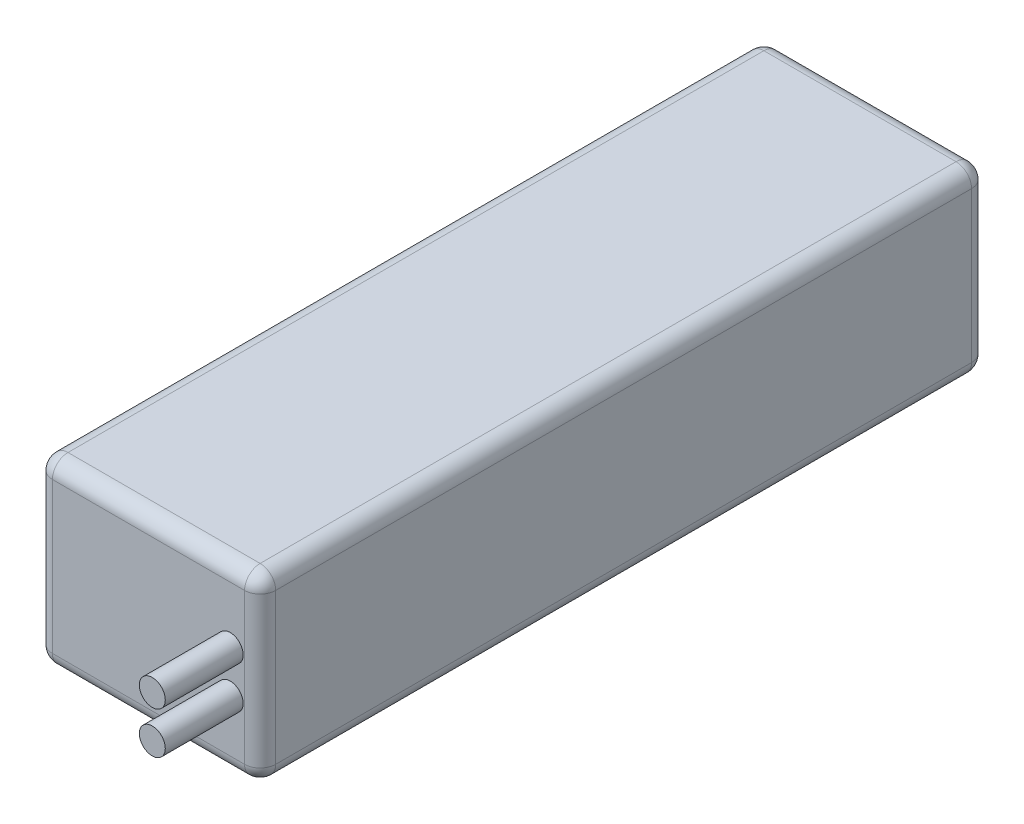
ISO-10303-21;
HEADER;
FILE_DESCRIPTION(('STEP AP214'),'2;1');
FILE_NAME('part.step','',(''),(''),'','','');
FILE_SCHEMA(('AUTOMOTIVE_DESIGN { 1 0 10303 214 1 1 1 1 }'));
ENDSEC;
DATA;
#1=APPLICATION_CONTEXT('core data for automotive mechanical design processes');
#2=APPLICATION_PROTOCOL_DEFINITION('international standard','automotive_design',2000,#1);
#3=PRODUCT_CONTEXT('',#1,'mechanical');
#4=PRODUCT('Part','Part','',(#3));
#5=PRODUCT_RELATED_PRODUCT_CATEGORY('part','',(#4));
#6=PRODUCT_DEFINITION_FORMATION('','',#4);
#7=PRODUCT_DEFINITION_CONTEXT('part definition',#1,'design');
#8=PRODUCT_DEFINITION('design','',#6,#7);
#9=PRODUCT_DEFINITION_SHAPE('','',#8);
#10=(LENGTH_UNIT() NAMED_UNIT(*) SI_UNIT(.MILLI.,.METRE.));
#11=(NAMED_UNIT(*) PLANE_ANGLE_UNIT() SI_UNIT($,.RADIAN.));
#12=(NAMED_UNIT(*) SI_UNIT($,.STERADIAN.) SOLID_ANGLE_UNIT());
#13=UNCERTAINTY_MEASURE_WITH_UNIT(LENGTH_MEASURE(1.E-05),#10,'distance_accuracy_value','');
#14=(GEOMETRIC_REPRESENTATION_CONTEXT(3) GLOBAL_UNCERTAINTY_ASSIGNED_CONTEXT((#13)) GLOBAL_UNIT_ASSIGNED_CONTEXT((#10,
#11,#12)) REPRESENTATION_CONTEXT('',''));
#15=CARTESIAN_POINT('',(0.,0.,0.));
#16=DIRECTION('',(0.,0.,1.));
#17=DIRECTION('',(1.,0.,0.));
#18=AXIS2_PLACEMENT_3D('',#15,#16,#17);
#19=CARTESIAN_POINT('',(0.,0.,140.));
#20=DIRECTION('',(0.,0.,1.));
#21=DIRECTION('',(1.,0.,0.));
#22=AXIS2_PLACEMENT_3D('',#19,#20,#21);
#23=PLANE('',#22);
#24=DIRECTION('',(0.,-1.,0.));
#25=VECTOR('',#24,1.);
#26=CARTESIAN_POINT('',(-18.5,-17.5,140.));
#27=LINE('',#26,#25);
#28=CARTESIAN_POINT('',(-18.5,14.5,140.));
#29=VERTEX_POINT('',#28);
#30=CARTESIAN_POINT('',(-18.5,-14.5,140.));
#31=VERTEX_POINT('',#30);
#32=EDGE_CURVE('E135',#29,#31,#27,.T.);
#33=ORIENTED_EDGE('',*,*,#32,.T.);
#34=DIRECTION('',(1.,0.,0.));
#35=VECTOR('',#34,1.);
#36=CARTESIAN_POINT('',(21.5,-14.5,140.));
#37=LINE('',#36,#35);
#38=CARTESIAN_POINT('',(18.5,-14.5,140.));
#39=VERTEX_POINT('',#38);
#40=EDGE_CURVE('E131',#31,#39,#37,.T.);
#41=ORIENTED_EDGE('',*,*,#40,.T.);
#42=DIRECTION('',(0.,1.,0.));
#43=VECTOR('',#42,1.);
#44=CARTESIAN_POINT('',(18.5,17.5,140.));
#45=LINE('',#44,#43);
#46=CARTESIAN_POINT('',(18.5,14.5,140.));
#47=VERTEX_POINT('',#46);
#48=EDGE_CURVE('E125',#39,#47,#45,.T.);
#49=ORIENTED_EDGE('',*,*,#48,.T.);
#50=DIRECTION('',(-1.,0.,0.));
#51=VECTOR('',#50,1.);
#52=CARTESIAN_POINT('',(-21.5,14.5,140.));
#53=LINE('',#52,#51);
#54=EDGE_CURVE('E128',#47,#29,#53,.T.);
#55=ORIENTED_EDGE('',*,*,#54,.T.);
#56=EDGE_LOOP('',(#33,#41,#49,#55));
#57=FACE_BOUND('',#56,.T.);
#58=CARTESIAN_POINT('',(15.7347430074703,3.59863996227682,140.));
#59=DIRECTION('',(0.,0.,1.));
#60=DIRECTION('',(1.,0.,0.));
#61=AXIS2_PLACEMENT_3D('',#58,#59,#60);
#62=CIRCLE('',#61,2.5);
#63=CARTESIAN_POINT('',(18.2347430074703,3.59863996227682,140.));
#64=VERTEX_POINT('',#63);
#65=EDGE_CURVE('E215',#64,#64,#62,.T.);
#66=ORIENTED_EDGE('',*,*,#65,.F.);
#67=EDGE_LOOP('',(#66));
#68=FACE_BOUND('',#67,.T.);
#69=CARTESIAN_POINT('',(15.7347430074703,-4.49209540118582,140.));
#70=DIRECTION('',(0.,0.,1.));
#71=DIRECTION('',(1.,0.,0.));
#72=AXIS2_PLACEMENT_3D('',#69,#70,#71);
#73=CIRCLE('',#72,2.5);
#74=CARTESIAN_POINT('',(18.2347430074703,-4.49209540118582,140.));
#75=VERTEX_POINT('',#74);
#76=EDGE_CURVE('E203',#75,#75,#73,.T.);
#77=ORIENTED_EDGE('',*,*,#76,.F.);
#78=EDGE_LOOP('',(#77));
#79=FACE_BOUND('',#78,.T.);
#80=ADVANCED_FACE('F37',(#57,#68,#79),#23,.T.);
#81=CARTESIAN_POINT('',(21.5,17.5,140.));
#82=DIRECTION('',(-1.,0.,0.));
#83=DIRECTION('',(0.,-1.,0.));
#84=AXIS2_PLACEMENT_3D('',#81,#82,#83);
#85=PLANE('',#84);
#86=DIRECTION('',(0.,1.,0.));
#87=VECTOR('',#86,1.);
#88=CARTESIAN_POINT('',(21.5,-17.5,137.));
#89=LINE('',#88,#87);
#90=CARTESIAN_POINT('',(21.5,14.5,137.));
#91=VERTEX_POINT('',#90);
#92=CARTESIAN_POINT('',(21.5,-14.5,137.));
#93=VERTEX_POINT('',#92);
#94=EDGE_CURVE('E157',#91,#93,#89,.F.);
#95=ORIENTED_EDGE('',*,*,#94,.T.);
#96=DIRECTION('',(0.,0.,-1.));
#97=VECTOR('',#96,1.);
#98=CARTESIAN_POINT('',(21.5,-14.5,140.));
#99=LINE('',#98,#97);
#100=CARTESIAN_POINT('',(21.5,-14.5,3.));
#101=VERTEX_POINT('',#100);
#102=EDGE_CURVE('E256',#93,#101,#99,.T.);
#103=ORIENTED_EDGE('',*,*,#102,.T.);
#104=DIRECTION('',(0.,1.,0.));
#105=VECTOR('',#104,1.);
#106=CARTESIAN_POINT('',(21.5,17.5,3.));
#107=LINE('',#106,#105);
#108=CARTESIAN_POINT('',(21.5,14.5,3.));
#109=VERTEX_POINT('',#108);
#110=EDGE_CURVE('E253',#101,#109,#107,.T.);
#111=ORIENTED_EDGE('',*,*,#110,.T.);
#112=DIRECTION('',(0.,0.,-1.));
#113=VECTOR('',#112,1.);
#114=CARTESIAN_POINT('',(21.5,14.5,140.));
#115=LINE('',#114,#113);
#116=EDGE_CURVE('E251',#109,#91,#115,.F.);
#117=ORIENTED_EDGE('',*,*,#116,.T.);
#118=EDGE_LOOP('',(#95,#103,#111,#117));
#119=FACE_BOUND('',#118,.T.);
#120=ADVANCED_FACE('F302',(#119),#85,.F.);
#121=CARTESIAN_POINT('',(-21.5,17.5,140.));
#122=DIRECTION('',(0.,-1.,0.));
#123=DIRECTION('',(0.,0.,-1.));
#124=AXIS2_PLACEMENT_3D('',#121,#122,#123);
#125=PLANE('',#124);
#126=DIRECTION('',(-1.,0.,0.));
#127=VECTOR('',#126,1.);
#128=CARTESIAN_POINT('',(21.5,17.5,137.));
#129=LINE('',#128,#127);
#130=CARTESIAN_POINT('',(-18.5,17.5,137.));
#131=VERTEX_POINT('',#130);
#132=CARTESIAN_POINT('',(18.5,17.5,137.));
#133=VERTEX_POINT('',#132);
#134=EDGE_CURVE('E46',#131,#133,#129,.F.);
#135=ORIENTED_EDGE('',*,*,#134,.T.);
#136=DIRECTION('',(0.,0.,-1.));
#137=VECTOR('',#136,1.);
#138=CARTESIAN_POINT('',(18.5,17.5,140.));
#139=LINE('',#138,#137);
#140=CARTESIAN_POINT('',(18.5,17.5,3.));
#141=VERTEX_POINT('',#140);
#142=EDGE_CURVE('E11',#133,#141,#139,.T.);
#143=ORIENTED_EDGE('',*,*,#142,.T.);
#144=DIRECTION('',(-1.,0.,0.));
#145=VECTOR('',#144,1.);
#146=CARTESIAN_POINT('',(-21.5,17.5,3.));
#147=LINE('',#146,#145);
#148=CARTESIAN_POINT('',(-18.5,17.5,3.));
#149=VERTEX_POINT('',#148);
#150=EDGE_CURVE('E259',#141,#149,#147,.T.);
#151=ORIENTED_EDGE('',*,*,#150,.T.);
#152=DIRECTION('',(0.,0.,-1.));
#153=VECTOR('',#152,1.);
#154=CARTESIAN_POINT('',(-18.5,17.5,140.));
#155=LINE('',#154,#153);
#156=EDGE_CURVE('E57',#149,#131,#155,.F.);
#157=ORIENTED_EDGE('',*,*,#156,.T.);
#158=EDGE_LOOP('',(#135,#143,#151,#157));
#159=FACE_BOUND('',#158,.T.);
#160=ADVANCED_FACE('F307',(#159),#125,.F.);
#161=CARTESIAN_POINT('',(-21.5,17.5,140.));
#162=DIRECTION('',(1.,0.,0.));
#163=DIRECTION('',(0.,1.,0.));
#164=AXIS2_PLACEMENT_3D('',#161,#162,#163);
#165=PLANE('',#164);
#166=DIRECTION('',(0.,0.,-1.));
#167=VECTOR('',#166,1.);
#168=CARTESIAN_POINT('',(-21.5,-14.5,140.));
#169=LINE('',#168,#167);
#170=CARTESIAN_POINT('',(-21.5,-14.5,3.));
#171=VERTEX_POINT('',#170);
#172=CARTESIAN_POINT('',(-21.5,-14.5,137.));
#173=VERTEX_POINT('',#172);
#174=EDGE_CURVE('E237',#171,#173,#169,.F.);
#175=ORIENTED_EDGE('',*,*,#174,.T.);
#176=DIRECTION('',(0.,-1.,0.));
#177=VECTOR('',#176,1.);
#178=CARTESIAN_POINT('',(-21.5,17.5,137.));
#179=LINE('',#178,#177);
#180=CARTESIAN_POINT('',(-21.5,14.5,137.));
#181=VERTEX_POINT('',#180);
#182=EDGE_CURVE('E239',#173,#181,#179,.F.);
#183=ORIENTED_EDGE('',*,*,#182,.T.);
#184=DIRECTION('',(0.,0.,-1.));
#185=VECTOR('',#184,1.);
#186=CARTESIAN_POINT('',(-21.5,14.5,140.));
#187=LINE('',#186,#185);
#188=CARTESIAN_POINT('',(-21.5,14.5,3.));
#189=VERTEX_POINT('',#188);
#190=EDGE_CURVE('E233',#181,#189,#187,.T.);
#191=ORIENTED_EDGE('',*,*,#190,.T.);
#192=DIRECTION('',(0.,-1.,0.));
#193=VECTOR('',#192,1.);
#194=CARTESIAN_POINT('',(-21.5,17.5,3.));
#195=LINE('',#194,#193);
#196=EDGE_CURVE('E235',#189,#171,#195,.T.);
#197=ORIENTED_EDGE('',*,*,#196,.T.);
#198=EDGE_LOOP('',(#175,#183,#191,#197));
#199=FACE_BOUND('',#198,.T.);
#200=ADVANCED_FACE('F322',(#199),#165,.F.);
#201=CARTESIAN_POINT('',(-21.5,-17.5,140.));
#202=DIRECTION('',(0.,1.,0.));
#203=DIRECTION('',(0.,0.,1.));
#204=AXIS2_PLACEMENT_3D('',#201,#202,#203);
#205=PLANE('',#204);
#206=DIRECTION('',(0.,0.,-1.));
#207=VECTOR('',#206,1.);
#208=CARTESIAN_POINT('',(18.5,-17.5,140.));
#209=LINE('',#208,#207);
#210=CARTESIAN_POINT('',(18.5,-17.5,3.));
#211=VERTEX_POINT('',#210);
#212=CARTESIAN_POINT('',(18.5,-17.5,137.));
#213=VERTEX_POINT('',#212);
#214=EDGE_CURVE('E224',#211,#213,#209,.F.);
#215=ORIENTED_EDGE('',*,*,#214,.T.);
#216=DIRECTION('',(1.,0.,0.));
#217=VECTOR('',#216,1.);
#218=CARTESIAN_POINT('',(-21.5,-17.5,137.));
#219=LINE('',#218,#217);
#220=CARTESIAN_POINT('',(-18.5,-17.5,137.));
#221=VERTEX_POINT('',#220);
#222=EDGE_CURVE('E230',#213,#221,#219,.F.);
#223=ORIENTED_EDGE('',*,*,#222,.T.);
#224=DIRECTION('',(0.,0.,-1.));
#225=VECTOR('',#224,1.);
#226=CARTESIAN_POINT('',(-18.5,-17.5,140.));
#227=LINE('',#226,#225);
#228=CARTESIAN_POINT('',(-18.5,-17.5,3.));
#229=VERTEX_POINT('',#228);
#230=EDGE_CURVE('E228',#221,#229,#227,.T.);
#231=ORIENTED_EDGE('',*,*,#230,.T.);
#232=DIRECTION('',(1.,0.,0.));
#233=VECTOR('',#232,1.);
#234=CARTESIAN_POINT('',(-21.5,-17.5,3.));
#235=LINE('',#234,#233);
#236=EDGE_CURVE('E226',#229,#211,#235,.T.);
#237=ORIENTED_EDGE('',*,*,#236,.T.);
#238=EDGE_LOOP('',(#215,#223,#231,#237));
#239=FACE_BOUND('',#238,.T.);
#240=ADVANCED_FACE('F289',(#239),#205,.F.);
#241=CARTESIAN_POINT('',(0.,0.,0.));
#242=DIRECTION('',(0.,0.,1.));
#243=DIRECTION('',(1.,0.,0.));
#244=AXIS2_PLACEMENT_3D('',#241,#242,#243);
#245=PLANE('',#244);
#246=DIRECTION('',(1.,0.,0.));
#247=VECTOR('',#246,1.);
#248=CARTESIAN_POINT('',(0.,-14.5,0.));
#249=LINE('',#248,#247);
#250=CARTESIAN_POINT('',(18.5,-14.5,0.));
#251=VERTEX_POINT('',#250);
#252=CARTESIAN_POINT('',(-18.5,-14.5,0.));
#253=VERTEX_POINT('',#252);
#254=EDGE_CURVE('E246',#251,#253,#249,.F.);
#255=ORIENTED_EDGE('',*,*,#254,.T.);
#256=DIRECTION('',(0.,-1.,0.));
#257=VECTOR('',#256,1.);
#258=CARTESIAN_POINT('',(-18.5,0.,0.));
#259=LINE('',#258,#257);
#260=CARTESIAN_POINT('',(-18.5,14.5,0.));
#261=VERTEX_POINT('',#260);
#262=EDGE_CURVE('E248',#253,#261,#259,.F.);
#263=ORIENTED_EDGE('',*,*,#262,.T.);
#264=DIRECTION('',(-1.,0.,0.));
#265=VECTOR('',#264,1.);
#266=CARTESIAN_POINT('',(0.,14.5,0.));
#267=LINE('',#266,#265);
#268=CARTESIAN_POINT('',(18.5,14.5,0.));
#269=VERTEX_POINT('',#268);
#270=EDGE_CURVE('E242',#261,#269,#267,.F.);
#271=ORIENTED_EDGE('',*,*,#270,.T.);
#272=DIRECTION('',(0.,1.,0.));
#273=VECTOR('',#272,1.);
#274=CARTESIAN_POINT('',(18.5,0.,0.));
#275=LINE('',#274,#273);
#276=EDGE_CURVE('E244',#269,#251,#275,.F.);
#277=ORIENTED_EDGE('',*,*,#276,.T.);
#278=EDGE_LOOP('',(#255,#263,#271,#277));
#279=FACE_BOUND('',#278,.T.);
#280=ADVANCED_FACE('F358',(#279),#245,.F.);
#281=CARTESIAN_POINT('',(15.7347430074703,3.59863996227682,155.));
#282=DIRECTION('',(0.,0.,-1.));
#283=DIRECTION('',(-1.,0.,0.));
#284=AXIS2_PLACEMENT_3D('',#281,#282,#283);
#285=CYLINDRICAL_SURFACE('',#284,2.5);
#286=CARTESIAN_POINT('',(15.7347430074703,3.59863996227682,155.));
#287=DIRECTION('',(0.,0.,1.));
#288=DIRECTION('',(1.,0.,0.));
#289=AXIS2_PLACEMENT_3D('',#286,#287,#288);
#290=CIRCLE('',#289,2.5);
#291=CARTESIAN_POINT('',(18.2347430074703,3.59863996227682,155.));
#292=VERTEX_POINT('',#291);
#293=EDGE_CURVE('E146',#292,#292,#290,.T.);
#294=ORIENTED_EDGE('',*,*,#293,.F.);
#295=EDGE_LOOP('',(#294));
#296=FACE_BOUND('',#295,.T.);
#297=ORIENTED_EDGE('',*,*,#65,.T.);
#298=EDGE_LOOP('',(#297));
#299=FACE_BOUND('',#298,.T.);
#300=ADVANCED_FACE('F356',(#296,#299),#285,.T.);
#301=CARTESIAN_POINT('',(15.7347430074703,3.59863996227682,155.));
#302=DIRECTION('',(0.,0.,1.));
#303=DIRECTION('',(1.,0.,0.));
#304=AXIS2_PLACEMENT_3D('',#301,#302,#303);
#305=PLANE('',#304);
#306=ORIENTED_EDGE('',*,*,#293,.T.);
#307=EDGE_LOOP('',(#306));
#308=FACE_BOUND('',#307,.T.);
#309=ADVANCED_FACE('F534',(#308),#305,.T.);
#310=CARTESIAN_POINT('',(15.7347430074703,-4.49209540118582,155.));
#311=DIRECTION('',(0.,0.,-1.));
#312=DIRECTION('',(-1.,0.,0.));
#313=AXIS2_PLACEMENT_3D('',#310,#311,#312);
#314=CYLINDRICAL_SURFACE('',#313,2.5);
#315=CARTESIAN_POINT('',(15.7347430074703,-4.49209540118582,155.));
#316=DIRECTION('',(0.,0.,1.));
#317=DIRECTION('',(1.,0.,0.));
#318=AXIS2_PLACEMENT_3D('',#315,#316,#317);
#319=CIRCLE('',#318,2.5);
#320=CARTESIAN_POINT('',(18.2347430074703,-4.49209540118582,155.));
#321=VERTEX_POINT('',#320);
#322=EDGE_CURVE('E210',#321,#321,#319,.T.);
#323=ORIENTED_EDGE('',*,*,#322,.F.);
#324=EDGE_LOOP('',(#323));
#325=FACE_BOUND('',#324,.T.);
#326=ORIENTED_EDGE('',*,*,#76,.T.);
#327=EDGE_LOOP('',(#326));
#328=FACE_BOUND('',#327,.T.);
#329=ADVANCED_FACE('F524',(#325,#328),#314,.T.);
#330=CARTESIAN_POINT('',(15.7347430074703,-4.49209540118582,155.));
#331=DIRECTION('',(0.,0.,1.));
#332=DIRECTION('',(1.,0.,0.));
#333=AXIS2_PLACEMENT_3D('',#330,#331,#332);
#334=PLANE('',#333);
#335=ORIENTED_EDGE('',*,*,#322,.T.);
#336=EDGE_LOOP('',(#335));
#337=FACE_BOUND('',#336,.T.);
#338=ADVANCED_FACE('F516',(#337),#334,.T.);
#339=CARTESIAN_POINT('',(-21.5,14.5,3.));
#340=DIRECTION('',(-1.,0.,0.));
#341=DIRECTION('',(0.,0.,1.));
#342=AXIS2_PLACEMENT_3D('',#339,#340,#341);
#343=CYLINDRICAL_SURFACE('',#342,3.);
#344=CARTESIAN_POINT('',(-18.5,14.5,3.));
#345=DIRECTION('',(-1.,0.,0.));
#346=DIRECTION('',(0.,0.,1.));
#347=AXIS2_PLACEMENT_3D('',#344,#345,#346);
#348=CIRCLE('',#347,3.);
#349=EDGE_CURVE('E41',#149,#261,#348,.T.);
#350=ORIENTED_EDGE('',*,*,#349,.F.);
#351=ORIENTED_EDGE('',*,*,#150,.F.);
#352=CARTESIAN_POINT('',(18.5,14.5,3.));
#353=DIRECTION('',(1.,0.,0.));
#354=DIRECTION('',(0.,0.,-1.));
#355=AXIS2_PLACEMENT_3D('',#352,#353,#354);
#356=CIRCLE('',#355,3.);
#357=EDGE_CURVE('E195',#269,#141,#356,.T.);
#358=ORIENTED_EDGE('',*,*,#357,.F.);
#359=ORIENTED_EDGE('',*,*,#270,.F.);
#360=EDGE_LOOP('',(#350,#351,#358,#359));
#361=FACE_BOUND('',#360,.T.);
#362=ADVANCED_FACE('F39',(#361),#343,.T.);
#363=CARTESIAN_POINT('',(-18.5,14.5,3.));
#364=DIRECTION('',(0.,0.,1.));
#365=DIRECTION('',(1.,0.,0.));
#366=AXIS2_PLACEMENT_3D('',#363,#364,#365);
#367=SPHERICAL_SURFACE('',#366,3.);
#368=CARTESIAN_POINT('',(-18.5,14.5,3.));
#369=DIRECTION('',(0.,0.,-1.));
#370=DIRECTION('',(-1.,0.,0.));
#371=AXIS2_PLACEMENT_3D('',#368,#369,#370);
#372=CIRCLE('',#371,3.);
#373=EDGE_CURVE('E191',#149,#189,#372,.F.);
#374=ORIENTED_EDGE('',*,*,#373,.F.);
#375=ORIENTED_EDGE('',*,*,#349,.T.);
#376=CARTESIAN_POINT('',(-18.5,14.5,3.));
#377=DIRECTION('',(0.,1.,0.));
#378=DIRECTION('',(0.,0.,1.));
#379=AXIS2_PLACEMENT_3D('',#376,#377,#378);
#380=CIRCLE('',#379,3.);
#381=EDGE_CURVE('E194',#189,#261,#380,.F.);
#382=ORIENTED_EDGE('',*,*,#381,.F.);
#383=EDGE_LOOP('',(#374,#375,#382));
#384=FACE_BOUND('',#383,.T.);
#385=ADVANCED_FACE('F309',(#384),#367,.T.);
#386=CARTESIAN_POINT('',(18.5,14.5,3.));
#387=DIRECTION('',(0.,0.,1.));
#388=DIRECTION('',(1.,0.,0.));
#389=AXIS2_PLACEMENT_3D('',#386,#387,#388);
#390=SPHERICAL_SURFACE('',#389,3.);
#391=CARTESIAN_POINT('',(18.5,14.5,3.));
#392=DIRECTION('',(0.,1.,0.));
#393=DIRECTION('',(0.,0.,1.));
#394=AXIS2_PLACEMENT_3D('',#391,#392,#393);
#395=CIRCLE('',#394,3.);
#396=EDGE_CURVE('E186',#269,#109,#395,.F.);
#397=ORIENTED_EDGE('',*,*,#396,.F.);
#398=ORIENTED_EDGE('',*,*,#357,.T.);
#399=CARTESIAN_POINT('',(18.5,14.5,3.));
#400=DIRECTION('',(0.,0.,-1.));
#401=DIRECTION('',(-1.,0.,0.));
#402=AXIS2_PLACEMENT_3D('',#399,#400,#401);
#403=CIRCLE('',#402,3.);
#404=EDGE_CURVE('E189',#109,#141,#403,.F.);
#405=ORIENTED_EDGE('',*,*,#404,.F.);
#406=EDGE_LOOP('',(#397,#398,#405));
#407=FACE_BOUND('',#406,.T.);
#408=ADVANCED_FACE('F340',(#407),#390,.T.);
#409=CARTESIAN_POINT('',(-18.5,17.5,3.));
#410=DIRECTION('',(0.,-1.,0.));
#411=DIRECTION('',(1.,0.,0.));
#412=AXIS2_PLACEMENT_3D('',#409,#410,#411);
#413=CYLINDRICAL_SURFACE('',#412,3.);
#414=ORIENTED_EDGE('',*,*,#381,.T.);
#415=ORIENTED_EDGE('',*,*,#262,.F.);
#416=CARTESIAN_POINT('',(-18.5,-14.5,3.));
#417=DIRECTION('',(0.,-1.,0.));
#418=DIRECTION('',(0.,0.,-1.));
#419=AXIS2_PLACEMENT_3D('',#416,#417,#418);
#420=CIRCLE('',#419,3.);
#421=EDGE_CURVE('E180',#171,#253,#420,.T.);
#422=ORIENTED_EDGE('',*,*,#421,.F.);
#423=ORIENTED_EDGE('',*,*,#196,.F.);
#424=EDGE_LOOP('',(#414,#415,#422,#423));
#425=FACE_BOUND('',#424,.T.);
#426=ADVANCED_FACE('F326',(#425),#413,.T.);
#427=CARTESIAN_POINT('',(-18.5,14.5,140.));
#428=DIRECTION('',(0.,0.,-1.));
#429=DIRECTION('',(-1.,0.,0.));
#430=AXIS2_PLACEMENT_3D('',#427,#428,#429);
#431=CYLINDRICAL_SURFACE('',#430,3.);
#432=ORIENTED_EDGE('',*,*,#373,.T.);
#433=ORIENTED_EDGE('',*,*,#190,.F.);
#434=CARTESIAN_POINT('',(-18.5,14.5,137.));
#435=DIRECTION('',(0.,0.,1.));
#436=DIRECTION('',(1.,0.,0.));
#437=AXIS2_PLACEMENT_3D('',#434,#435,#436);
#438=CIRCLE('',#437,3.);
#439=EDGE_CURVE('E177',#131,#181,#438,.T.);
#440=ORIENTED_EDGE('',*,*,#439,.F.);
#441=ORIENTED_EDGE('',*,*,#156,.F.);
#442=EDGE_LOOP('',(#432,#433,#440,#441));
#443=FACE_BOUND('',#442,.T.);
#444=ADVANCED_FACE('F314',(#443),#431,.T.);
#445=CARTESIAN_POINT('',(0.,14.5,137.));
#446=DIRECTION('',(1.,0.,0.));
#447=DIRECTION('',(0.,0.,-1.));
#448=AXIS2_PLACEMENT_3D('',#445,#446,#447);
#449=CYLINDRICAL_SURFACE('',#448,3.);
#450=CARTESIAN_POINT('',(18.5,14.5,137.));
#451=DIRECTION('',(1.,0.,0.));
#452=DIRECTION('',(0.,0.,-1.));
#453=AXIS2_PLACEMENT_3D('',#450,#451,#452);
#454=CIRCLE('',#453,3.);
#455=EDGE_CURVE('E141',#133,#47,#454,.T.);
#456=ORIENTED_EDGE('',*,*,#455,.F.);
#457=ORIENTED_EDGE('',*,*,#134,.F.);
#458=CARTESIAN_POINT('',(-18.5,14.5,137.));
#459=DIRECTION('',(-1.,0.,0.));
#460=DIRECTION('',(0.,0.,1.));
#461=AXIS2_PLACEMENT_3D('',#458,#459,#460);
#462=CIRCLE('',#461,3.);
#463=EDGE_CURVE('E144',#29,#131,#462,.T.);
#464=ORIENTED_EDGE('',*,*,#463,.F.);
#465=ORIENTED_EDGE('',*,*,#54,.F.);
#466=EDGE_LOOP('',(#456,#457,#464,#465));
#467=FACE_BOUND('',#466,.T.);
#468=ADVANCED_FACE('F140',(#467),#449,.T.);
#469=CARTESIAN_POINT('',(18.5,14.5,140.));
#470=DIRECTION('',(0.,0.,-1.));
#471=DIRECTION('',(-1.,0.,0.));
#472=AXIS2_PLACEMENT_3D('',#469,#470,#471);
#473=CYLINDRICAL_SURFACE('',#472,3.);
#474=ORIENTED_EDGE('',*,*,#404,.T.);
#475=ORIENTED_EDGE('',*,*,#142,.F.);
#476=CARTESIAN_POINT('',(18.5,14.5,137.));
#477=DIRECTION('',(0.,0.,1.));
#478=DIRECTION('',(1.,0.,0.));
#479=AXIS2_PLACEMENT_3D('',#476,#477,#478);
#480=CIRCLE('',#479,3.);
#481=EDGE_CURVE('E154',#91,#133,#480,.T.);
#482=ORIENTED_EDGE('',*,*,#481,.F.);
#483=ORIENTED_EDGE('',*,*,#116,.F.);
#484=EDGE_LOOP('',(#474,#475,#482,#483));
#485=FACE_BOUND('',#484,.T.);
#486=ADVANCED_FACE('F306',(#485),#473,.T.);
#487=CARTESIAN_POINT('',(18.5,17.5,3.));
#488=DIRECTION('',(0.,1.,0.));
#489=DIRECTION('',(-1.,0.,0.));
#490=AXIS2_PLACEMENT_3D('',#487,#488,#489);
#491=CYLINDRICAL_SURFACE('',#490,3.);
#492=ORIENTED_EDGE('',*,*,#396,.T.);
#493=ORIENTED_EDGE('',*,*,#110,.F.);
#494=CARTESIAN_POINT('',(18.5,-14.5,3.));
#495=DIRECTION('',(0.,-1.,0.));
#496=DIRECTION('',(1.,0.,0.));
#497=AXIS2_PLACEMENT_3D('',#494,#495,#496);
#498=CIRCLE('',#497,3.);
#499=EDGE_CURVE('E172',#251,#101,#498,.T.);
#500=ORIENTED_EDGE('',*,*,#499,.F.);
#501=ORIENTED_EDGE('',*,*,#276,.F.);
#502=EDGE_LOOP('',(#492,#493,#500,#501));
#503=FACE_BOUND('',#502,.T.);
#504=ADVANCED_FACE('F339',(#503),#491,.T.);
#505=CARTESIAN_POINT('',(-21.5,-14.5,3.));
#506=DIRECTION('',(1.,0.,0.));
#507=DIRECTION('',(0.,0.,-1.));
#508=AXIS2_PLACEMENT_3D('',#505,#506,#507);
#509=CYLINDRICAL_SURFACE('',#508,3.);
#510=CARTESIAN_POINT('',(-18.5,-14.5,3.));
#511=DIRECTION('',(-1.,0.,0.));
#512=DIRECTION('',(0.,0.,1.));
#513=AXIS2_PLACEMENT_3D('',#510,#511,#512);
#514=CIRCLE('',#513,3.);
#515=EDGE_CURVE('E183',#253,#229,#514,.T.);
#516=ORIENTED_EDGE('',*,*,#515,.F.);
#517=ORIENTED_EDGE('',*,*,#254,.F.);
#518=CARTESIAN_POINT('',(18.5,-14.5,3.));
#519=DIRECTION('',(1.,0.,0.));
#520=DIRECTION('',(0.,0.,-1.));
#521=AXIS2_PLACEMENT_3D('',#518,#519,#520);
#522=CIRCLE('',#521,3.);
#523=EDGE_CURVE('E169',#211,#251,#522,.T.);
#524=ORIENTED_EDGE('',*,*,#523,.F.);
#525=ORIENTED_EDGE('',*,*,#236,.F.);
#526=EDGE_LOOP('',(#516,#517,#524,#525));
#527=FACE_BOUND('',#526,.T.);
#528=ADVANCED_FACE('F332',(#527),#509,.T.);
#529=CARTESIAN_POINT('',(-18.5,-14.5,3.));
#530=DIRECTION('',(0.,0.,1.));
#531=DIRECTION('',(1.,0.,0.));
#532=AXIS2_PLACEMENT_3D('',#529,#530,#531);
#533=SPHERICAL_SURFACE('',#532,3.);
#534=ORIENTED_EDGE('',*,*,#421,.T.);
#535=ORIENTED_EDGE('',*,*,#515,.T.);
#536=CARTESIAN_POINT('',(-18.5,-14.5,3.));
#537=DIRECTION('',(0.,0.,-1.));
#538=DIRECTION('',(-1.,0.,0.));
#539=AXIS2_PLACEMENT_3D('',#536,#537,#538);
#540=CIRCLE('',#539,3.);
#541=EDGE_CURVE('E161',#171,#229,#540,.F.);
#542=ORIENTED_EDGE('',*,*,#541,.F.);
#543=EDGE_LOOP('',(#534,#535,#542));
#544=FACE_BOUND('',#543,.T.);
#545=ADVANCED_FACE('F329',(#544),#533,.T.);
#546=CARTESIAN_POINT('',(-18.5,14.5,137.));
#547=DIRECTION('',(0.,0.,1.));
#548=DIRECTION('',(1.,0.,0.));
#549=AXIS2_PLACEMENT_3D('',#546,#547,#548);
#550=SPHERICAL_SURFACE('',#549,3.);
#551=ORIENTED_EDGE('',*,*,#463,.T.);
#552=ORIENTED_EDGE('',*,*,#439,.T.);
#553=CARTESIAN_POINT('',(-18.5,14.5,137.));
#554=DIRECTION('',(0.,1.,0.));
#555=DIRECTION('',(0.,0.,1.));
#556=AXIS2_PLACEMENT_3D('',#553,#554,#555);
#557=CIRCLE('',#556,3.);
#558=EDGE_CURVE('E158',#29,#181,#557,.F.);
#559=ORIENTED_EDGE('',*,*,#558,.F.);
#560=EDGE_LOOP('',(#551,#552,#559));
#561=FACE_BOUND('',#560,.T.);
#562=ADVANCED_FACE('F316',(#561),#550,.T.);
#563=CARTESIAN_POINT('',(18.5,14.5,137.));
#564=DIRECTION('',(0.,0.,1.));
#565=DIRECTION('',(1.,0.,0.));
#566=AXIS2_PLACEMENT_3D('',#563,#564,#565);
#567=SPHERICAL_SURFACE('',#566,3.);
#568=ORIENTED_EDGE('',*,*,#481,.T.);
#569=ORIENTED_EDGE('',*,*,#455,.T.);
#570=CARTESIAN_POINT('',(18.5,14.5,137.));
#571=DIRECTION('',(0.,1.,0.));
#572=DIRECTION('',(0.,0.,1.));
#573=AXIS2_PLACEMENT_3D('',#570,#571,#572);
#574=CIRCLE('',#573,3.);
#575=EDGE_CURVE('E151',#91,#47,#574,.F.);
#576=ORIENTED_EDGE('',*,*,#575,.F.);
#577=EDGE_LOOP('',(#568,#569,#576));
#578=FACE_BOUND('',#577,.T.);
#579=ADVANCED_FACE('F150',(#578),#567,.T.);
#580=CARTESIAN_POINT('',(18.5,-14.5,3.));
#581=DIRECTION('',(0.,0.,1.));
#582=DIRECTION('',(1.,0.,0.));
#583=AXIS2_PLACEMENT_3D('',#580,#581,#582);
#584=SPHERICAL_SURFACE('',#583,3.);
#585=ORIENTED_EDGE('',*,*,#523,.T.);
#586=ORIENTED_EDGE('',*,*,#499,.T.);
#587=CARTESIAN_POINT('',(18.5,-14.5,3.));
#588=DIRECTION('',(0.,0.,-1.));
#589=DIRECTION('',(-1.,0.,0.));
#590=AXIS2_PLACEMENT_3D('',#587,#588,#589);
#591=CIRCLE('',#590,3.);
#592=EDGE_CURVE('E159',#211,#101,#591,.F.);
#593=ORIENTED_EDGE('',*,*,#592,.F.);
#594=EDGE_LOOP('',(#585,#586,#593));
#595=FACE_BOUND('',#594,.T.);
#596=ADVANCED_FACE('F336',(#595),#584,.T.);
#597=CARTESIAN_POINT('',(-18.5,-14.5,140.));
#598=DIRECTION('',(0.,0.,-1.));
#599=DIRECTION('',(-1.,0.,0.));
#600=AXIS2_PLACEMENT_3D('',#597,#598,#599);
#601=CYLINDRICAL_SURFACE('',#600,3.);
#602=ORIENTED_EDGE('',*,*,#541,.T.);
#603=ORIENTED_EDGE('',*,*,#230,.F.);
#604=CARTESIAN_POINT('',(-18.5,-14.5,137.));
#605=DIRECTION('',(0.,0.,1.));
#606=DIRECTION('',(1.,0.,0.));
#607=AXIS2_PLACEMENT_3D('',#604,#605,#606);
#608=CIRCLE('',#607,3.);
#609=EDGE_CURVE('E163',#173,#221,#608,.T.);
#610=ORIENTED_EDGE('',*,*,#609,.F.);
#611=ORIENTED_EDGE('',*,*,#174,.F.);
#612=EDGE_LOOP('',(#602,#603,#610,#611));
#613=FACE_BOUND('',#612,.T.);
#614=ADVANCED_FACE('F284',(#613),#601,.T.);
#615=CARTESIAN_POINT('',(-18.5,0.,137.));
#616=DIRECTION('',(0.,1.,0.));
#617=DIRECTION('',(-1.,0.,0.));
#618=AXIS2_PLACEMENT_3D('',#615,#616,#617);
#619=CYLINDRICAL_SURFACE('',#618,3.);
#620=ORIENTED_EDGE('',*,*,#558,.T.);
#621=ORIENTED_EDGE('',*,*,#182,.F.);
#622=CARTESIAN_POINT('',(-18.5,-14.5,137.));
#623=DIRECTION('',(0.,-1.,0.));
#624=DIRECTION('',(0.,0.,-1.));
#625=AXIS2_PLACEMENT_3D('',#622,#623,#624);
#626=CIRCLE('',#625,3.);
#627=EDGE_CURVE('E273',#31,#173,#626,.T.);
#628=ORIENTED_EDGE('',*,*,#627,.F.);
#629=ORIENTED_EDGE('',*,*,#32,.F.);
#630=EDGE_LOOP('',(#620,#621,#628,#629));
#631=FACE_BOUND('',#630,.T.);
#632=ADVANCED_FACE('F320',(#631),#619,.T.);
#633=CARTESIAN_POINT('',(18.5,0.,137.));
#634=DIRECTION('',(0.,-1.,0.));
#635=DIRECTION('',(1.,0.,0.));
#636=AXIS2_PLACEMENT_3D('',#633,#634,#635);
#637=CYLINDRICAL_SURFACE('',#636,3.);
#638=ORIENTED_EDGE('',*,*,#575,.T.);
#639=ORIENTED_EDGE('',*,*,#48,.F.);
#640=CARTESIAN_POINT('',(18.5,-14.5,137.));
#641=DIRECTION('',(0.,-1.,0.));
#642=DIRECTION('',(0.,0.,-1.));
#643=AXIS2_PLACEMENT_3D('',#640,#641,#642);
#644=CIRCLE('',#643,3.);
#645=EDGE_CURVE('E270',#93,#39,#644,.T.);
#646=ORIENTED_EDGE('',*,*,#645,.F.);
#647=ORIENTED_EDGE('',*,*,#94,.F.);
#648=EDGE_LOOP('',(#638,#639,#646,#647));
#649=FACE_BOUND('',#648,.T.);
#650=ADVANCED_FACE('F156',(#649),#637,.T.);
#651=CARTESIAN_POINT('',(18.5,-14.5,140.));
#652=DIRECTION('',(0.,0.,-1.));
#653=DIRECTION('',(-1.,0.,0.));
#654=AXIS2_PLACEMENT_3D('',#651,#652,#653);
#655=CYLINDRICAL_SURFACE('',#654,3.);
#656=ORIENTED_EDGE('',*,*,#592,.T.);
#657=ORIENTED_EDGE('',*,*,#102,.F.);
#658=CARTESIAN_POINT('',(18.5,-14.5,137.));
#659=DIRECTION('',(0.,0.,1.));
#660=DIRECTION('',(1.,0.,0.));
#661=AXIS2_PLACEMENT_3D('',#658,#659,#660);
#662=CIRCLE('',#661,3.);
#663=EDGE_CURVE('E267',#213,#93,#662,.T.);
#664=ORIENTED_EDGE('',*,*,#663,.F.);
#665=ORIENTED_EDGE('',*,*,#214,.F.);
#666=EDGE_LOOP('',(#656,#657,#664,#665));
#667=FACE_BOUND('',#666,.T.);
#668=ADVANCED_FACE('F299',(#667),#655,.T.);
#669=CARTESIAN_POINT('',(-18.5,-14.5,137.));
#670=DIRECTION('',(0.,0.,1.));
#671=DIRECTION('',(1.,0.,0.));
#672=AXIS2_PLACEMENT_3D('',#669,#670,#671);
#673=SPHERICAL_SURFACE('',#672,3.);
#674=ORIENTED_EDGE('',*,*,#627,.T.);
#675=ORIENTED_EDGE('',*,*,#609,.T.);
#676=CARTESIAN_POINT('',(-18.5,-14.5,137.));
#677=DIRECTION('',(-1.,0.,0.));
#678=DIRECTION('',(0.,0.,1.));
#679=AXIS2_PLACEMENT_3D('',#676,#677,#678);
#680=CIRCLE('',#679,3.);
#681=EDGE_CURVE('E265',#31,#221,#680,.F.);
#682=ORIENTED_EDGE('',*,*,#681,.F.);
#683=EDGE_LOOP('',(#674,#675,#682));
#684=FACE_BOUND('',#683,.T.);
#685=ADVANCED_FACE('F280',(#684),#673,.T.);
#686=CARTESIAN_POINT('',(18.5,-14.5,137.));
#687=DIRECTION('',(0.,0.,1.));
#688=DIRECTION('',(1.,0.,0.));
#689=AXIS2_PLACEMENT_3D('',#686,#687,#688);
#690=SPHERICAL_SURFACE('',#689,3.);
#691=ORIENTED_EDGE('',*,*,#663,.T.);
#692=ORIENTED_EDGE('',*,*,#645,.T.);
#693=CARTESIAN_POINT('',(18.5,-14.5,137.));
#694=DIRECTION('',(1.,0.,0.));
#695=DIRECTION('',(0.,1.,0.));
#696=AXIS2_PLACEMENT_3D('',#693,#694,#695);
#697=CIRCLE('',#696,3.);
#698=EDGE_CURVE('E263',#213,#39,#697,.F.);
#699=ORIENTED_EDGE('',*,*,#698,.F.);
#700=EDGE_LOOP('',(#691,#692,#699));
#701=FACE_BOUND('',#700,.T.);
#702=ADVANCED_FACE('F296',(#701),#690,.T.);
#703=CARTESIAN_POINT('',(0.,-14.5,137.));
#704=DIRECTION('',(-1.,0.,0.));
#705=DIRECTION('',(0.,0.,1.));
#706=AXIS2_PLACEMENT_3D('',#703,#704,#705);
#707=CYLINDRICAL_SURFACE('',#706,3.);
#708=ORIENTED_EDGE('',*,*,#681,.T.);
#709=ORIENTED_EDGE('',*,*,#222,.F.);
#710=ORIENTED_EDGE('',*,*,#698,.T.);
#711=ORIENTED_EDGE('',*,*,#40,.F.);
#712=EDGE_LOOP('',(#708,#709,#710,#711));
#713=FACE_BOUND('',#712,.T.);
#714=ADVANCED_FACE('F294',(#713),#707,.T.);
#715=CLOSED_SHELL('',(#80,#120,#160,#200,#240,#280,#300,#309,#329,#338,#362,#385,#408,#426,#444,
#468,#486,#504,#528,#545,#562,#579,#596,#614,#632,#650,#668,#685,#702,#714));
#716=MANIFOLD_SOLID_BREP('B2',#715);
#717=ADVANCED_BREP_SHAPE_REPRESENTATION('',(#18,#716),#14);
#718=SHAPE_DEFINITION_REPRESENTATION(#9,#717);
ENDSEC;
END-ISO-10303-21;
